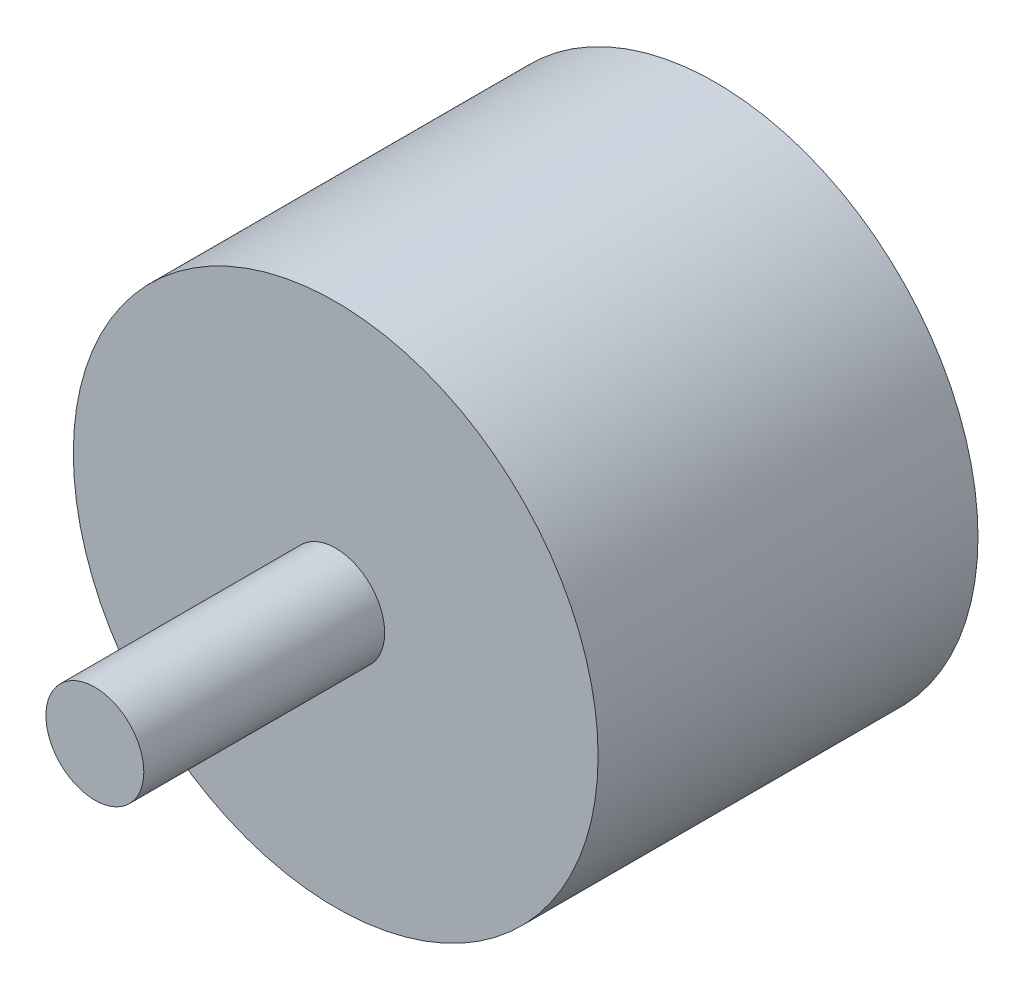
ISO-10303-21;
HEADER;
FILE_DESCRIPTION(('STEP AP214'),'2;1');
FILE_NAME('part.step','',(''),(''),'','','');
FILE_SCHEMA(('AUTOMOTIVE_DESIGN { 1 0 10303 214 1 1 1 1 }'));
ENDSEC;
DATA;
#1=APPLICATION_CONTEXT('core data for automotive mechanical design processes');
#2=APPLICATION_PROTOCOL_DEFINITION('international standard','automotive_design',2000,#1);
#3=PRODUCT_CONTEXT('',#1,'mechanical');
#4=PRODUCT('Part','Part','',(#3));
#5=PRODUCT_RELATED_PRODUCT_CATEGORY('part','',(#4));
#6=PRODUCT_DEFINITION_FORMATION('','',#4);
#7=PRODUCT_DEFINITION_CONTEXT('part definition',#1,'design');
#8=PRODUCT_DEFINITION('design','',#6,#7);
#9=PRODUCT_DEFINITION_SHAPE('','',#8);
#10=(LENGTH_UNIT() NAMED_UNIT(*) SI_UNIT(.MILLI.,.METRE.));
#11=(NAMED_UNIT(*) PLANE_ANGLE_UNIT() SI_UNIT($,.RADIAN.));
#12=(NAMED_UNIT(*) SI_UNIT($,.STERADIAN.) SOLID_ANGLE_UNIT());
#13=UNCERTAINTY_MEASURE_WITH_UNIT(LENGTH_MEASURE(1.E-05),#10,'distance_accuracy_value','');
#14=(GEOMETRIC_REPRESENTATION_CONTEXT(3) GLOBAL_UNCERTAINTY_ASSIGNED_CONTEXT((#13)) GLOBAL_UNIT_ASSIGNED_CONTEXT((#10,
#11,#12)) REPRESENTATION_CONTEXT('',''));
#15=CARTESIAN_POINT('',(0.,0.,0.));
#16=DIRECTION('',(0.,0.,1.));
#17=DIRECTION('',(1.,0.,0.));
#18=AXIS2_PLACEMENT_3D('',#15,#16,#17);
#19=CARTESIAN_POINT('',(0.,0.,31.7));
#20=DIRECTION('',(0.,0.,1.));
#21=DIRECTION('',(1.,0.,0.));
#22=AXIS2_PLACEMENT_3D('',#19,#20,#21);
#23=PLANE('',#22);
#24=CARTESIAN_POINT('',(0.,0.,31.7));
#25=DIRECTION('',(0.,0.,1.));
#26=DIRECTION('',(1.,0.,0.));
#27=AXIS2_PLACEMENT_3D('',#24,#25,#26);
#28=CIRCLE('',#27,2.5);
#29=CARTESIAN_POINT('',(2.5,0.,31.7));
#30=VERTEX_POINT('',#29);
#31=EDGE_CURVE('E10',#30,#30,#28,.T.);
#32=ORIENTED_EDGE('',*,*,#31,.T.);
#33=EDGE_LOOP('',(#32));
#34=FACE_BOUND('',#33,.T.);
#35=ADVANCED_FACE('F15',(#34),#23,.T.);
#36=CARTESIAN_POINT('',(0.,0.,5.));
#37=DIRECTION('',(0.,0.,1.));
#38=DIRECTION('',(1.,0.,0.));
#39=AXIS2_PLACEMENT_3D('',#36,#37,#38);
#40=PLANE('',#39);
#41=CARTESIAN_POINT('',(0.,0.,5.));
#42=DIRECTION('',(0.,0.,1.));
#43=DIRECTION('',(1.,0.,0.));
#44=AXIS2_PLACEMENT_3D('',#41,#42,#43);
#45=CIRCLE('',#44,2.5);
#46=CARTESIAN_POINT('',(2.5,0.,5.));
#47=VERTEX_POINT('',#46);
#48=EDGE_CURVE('E42',#47,#47,#45,.T.);
#49=ORIENTED_EDGE('',*,*,#48,.F.);
#50=EDGE_LOOP('',(#49));
#51=FACE_BOUND('',#50,.T.);
#52=ADVANCED_FACE('F108',(#51),#40,.F.);
#53=CARTESIAN_POINT('',(0.,0.,19.4));
#54=DIRECTION('',(0.,0.,-1.));
#55=DIRECTION('',(1.,0.,0.));
#56=AXIS2_PLACEMENT_3D('',#53,#54,#55);
#57=CYLINDRICAL_SURFACE('',#56,2.5);
#58=CARTESIAN_POINT('',(0.,0.,19.4));
#59=DIRECTION('',(0.,0.,1.));
#60=DIRECTION('',(1.,0.,0.));
#61=AXIS2_PLACEMENT_3D('',#58,#59,#60);
#62=CIRCLE('',#61,2.5);
#63=CARTESIAN_POINT('',(2.5,0.,19.4));
#64=VERTEX_POINT('',#63);
#65=EDGE_CURVE('E74',#64,#64,#62,.T.);
#66=ORIENTED_EDGE('',*,*,#65,.T.);
#67=DIRECTION('',(0.,0.,1.));
#68=VECTOR('',#67,1.);
#69=CARTESIAN_POINT('',(2.5,0.,19.4));
#70=LINE('',#69,#68);
#71=EDGE_CURVE('E23',#64,#30,#70,.T.);
#72=ORIENTED_EDGE('',*,*,#71,.T.);
#73=ORIENTED_EDGE('',*,*,#31,.F.);
#74=ORIENTED_EDGE('',*,*,#71,.F.);
#75=EDGE_LOOP('',(#66,#72,#73,#74));
#76=FACE_BOUND('',#75,.T.);
#77=ADVANCED_FACE('F89',(#76),#57,.T.);
#78=CARTESIAN_POINT('',(0.,0.,0.));
#79=DIRECTION('',(0.,0.,-1.));
#80=DIRECTION('',(1.,0.,0.));
#81=AXIS2_PLACEMENT_3D('',#78,#79,#80);
#82=CYLINDRICAL_SURFACE('',#81,2.5);
#83=DIRECTION('',(0.,0.,1.));
#84=VECTOR('',#83,1.);
#85=CARTESIAN_POINT('',(2.5,0.,0.));
#86=LINE('',#85,#84);
#87=CARTESIAN_POINT('',(2.5,0.,0.));
#88=VERTEX_POINT('',#87);
#89=EDGE_CURVE('E78',#88,#47,#86,.T.);
#90=ORIENTED_EDGE('',*,*,#89,.T.);
#91=ORIENTED_EDGE('',*,*,#48,.T.);
#92=ORIENTED_EDGE('',*,*,#89,.F.);
#93=CARTESIAN_POINT('',(0.,0.,0.));
#94=DIRECTION('',(0.,0.,1.));
#95=DIRECTION('',(1.,0.,0.));
#96=AXIS2_PLACEMENT_3D('',#93,#94,#95);
#97=CIRCLE('',#96,2.5);
#98=EDGE_CURVE('E70',#88,#88,#97,.T.);
#99=ORIENTED_EDGE('',*,*,#98,.F.);
#100=EDGE_LOOP('',(#90,#91,#92,#99));
#101=FACE_BOUND('',#100,.T.);
#102=ADVANCED_FACE('F96',(#101),#82,.F.);
#103=CARTESIAN_POINT('',(0.,0.,19.4));
#104=DIRECTION('',(0.,0.,1.));
#105=DIRECTION('',(1.,0.,0.));
#106=AXIS2_PLACEMENT_3D('',#103,#104,#105);
#107=PLANE('',#106);
#108=ORIENTED_EDGE('',*,*,#65,.F.);
#109=EDGE_LOOP('',(#108));
#110=FACE_BOUND('',#109,.T.);
#111=CARTESIAN_POINT('',(0.,0.,19.4));
#112=DIRECTION('',(0.,0.,1.));
#113=DIRECTION('',(1.,0.,0.));
#114=AXIS2_PLACEMENT_3D('',#111,#112,#113);
#115=CIRCLE('',#114,13.4);
#116=CARTESIAN_POINT('',(13.4,0.,19.4));
#117=VERTEX_POINT('',#116);
#118=EDGE_CURVE('E64',#117,#117,#115,.T.);
#119=ORIENTED_EDGE('',*,*,#118,.T.);
#120=EDGE_LOOP('',(#119));
#121=FACE_BOUND('',#120,.T.);
#122=ADVANCED_FACE('F92',(#110,#121),#107,.T.);
#123=CARTESIAN_POINT('',(0.,0.,0.));
#124=DIRECTION('',(0.,0.,1.));
#125=DIRECTION('',(1.,0.,0.));
#126=AXIS2_PLACEMENT_3D('',#123,#124,#125);
#127=PLANE('',#126);
#128=ORIENTED_EDGE('',*,*,#98,.T.);
#129=EDGE_LOOP('',(#128));
#130=FACE_BOUND('',#129,.T.);
#131=CARTESIAN_POINT('',(0.,0.,0.));
#132=DIRECTION('',(0.,0.,1.));
#133=DIRECTION('',(1.,0.,0.));
#134=AXIS2_PLACEMENT_3D('',#131,#132,#133);
#135=CIRCLE('',#134,13.4);
#136=CARTESIAN_POINT('',(13.4,0.,0.));
#137=VERTEX_POINT('',#136);
#138=EDGE_CURVE('E63',#137,#137,#135,.T.);
#139=ORIENTED_EDGE('',*,*,#138,.F.);
#140=EDGE_LOOP('',(#139));
#141=FACE_BOUND('',#140,.T.);
#142=ADVANCED_FACE('F95',(#130,#141),#127,.F.);
#143=CARTESIAN_POINT('',(0.,0.,0.));
#144=DIRECTION('',(0.,0.,-1.));
#145=DIRECTION('',(1.,0.,0.));
#146=AXIS2_PLACEMENT_3D('',#143,#144,#145);
#147=CYLINDRICAL_SURFACE('',#146,13.4);
#148=ORIENTED_EDGE('',*,*,#138,.T.);
#149=DIRECTION('',(0.,0.,1.));
#150=VECTOR('',#149,1.);
#151=CARTESIAN_POINT('',(13.4,0.,0.));
#152=LINE('',#151,#150);
#153=EDGE_CURVE('E60',#137,#117,#152,.T.);
#154=ORIENTED_EDGE('',*,*,#153,.T.);
#155=ORIENTED_EDGE('',*,*,#118,.F.);
#156=ORIENTED_EDGE('',*,*,#153,.F.);
#157=EDGE_LOOP('',(#148,#154,#155,#156));
#158=FACE_BOUND('',#157,.T.);
#159=ADVANCED_FACE('F61',(#158),#147,.T.);
#160=CLOSED_SHELL('',(#35,#52,#77,#102,#122,#142,#159));
#161=MANIFOLD_SOLID_BREP('B1',#160);
#162=ADVANCED_BREP_SHAPE_REPRESENTATION('',(#18,#161),#14);
#163=SHAPE_DEFINITION_REPRESENTATION(#9,#162);
ENDSEC;
END-ISO-10303-21;
